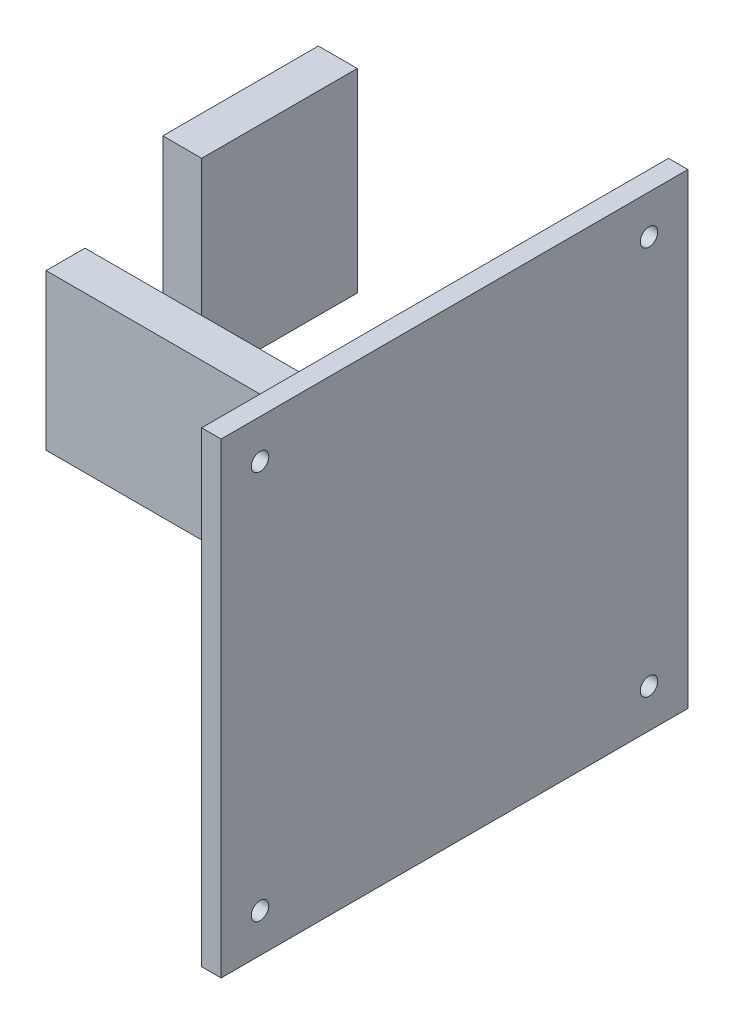
ISO-10303-21;
HEADER;
FILE_DESCRIPTION(('STEP AP214'),'2;1');
FILE_NAME('part.step','',(''),(''),'','','');
FILE_SCHEMA(('AUTOMOTIVE_DESIGN { 1 0 10303 214 1 1 1 1 }'));
ENDSEC;
DATA;
#1=APPLICATION_CONTEXT('core data for automotive mechanical design processes');
#2=APPLICATION_PROTOCOL_DEFINITION('international standard','automotive_design',2000,#1);
#3=PRODUCT_CONTEXT('',#1,'mechanical');
#4=PRODUCT('Part','Part','',(#3));
#5=PRODUCT_RELATED_PRODUCT_CATEGORY('part','',(#4));
#6=PRODUCT_DEFINITION_FORMATION('','',#4);
#7=PRODUCT_DEFINITION_CONTEXT('part definition',#1,'design');
#8=PRODUCT_DEFINITION('design','',#6,#7);
#9=PRODUCT_DEFINITION_SHAPE('','',#8);
#10=(LENGTH_UNIT() NAMED_UNIT(*) SI_UNIT(.MILLI.,.METRE.));
#11=(NAMED_UNIT(*) PLANE_ANGLE_UNIT() SI_UNIT($,.RADIAN.));
#12=(NAMED_UNIT(*) SI_UNIT($,.STERADIAN.) SOLID_ANGLE_UNIT());
#13=UNCERTAINTY_MEASURE_WITH_UNIT(LENGTH_MEASURE(1.E-05),#10,'distance_accuracy_value','');
#14=(GEOMETRIC_REPRESENTATION_CONTEXT(3) GLOBAL_UNCERTAINTY_ASSIGNED_CONTEXT((#13)) GLOBAL_UNIT_ASSIGNED_CONTEXT((#10,
#11,#12)) REPRESENTATION_CONTEXT('',''));
#15=CARTESIAN_POINT('',(0.,0.,0.));
#16=DIRECTION('',(0.,0.,1.));
#17=DIRECTION('',(1.,0.,0.));
#18=AXIS2_PLACEMENT_3D('',#15,#16,#17);
#19=CARTESIAN_POINT('',(9.99999999999999,20.,60.));
#20=DIRECTION('',(0.,-1.,0.));
#21=DIRECTION('',(0.,0.,-1.));
#22=AXIS2_PLACEMENT_3D('',#19,#20,#21);
#23=PLANE('',#22);
#24=DIRECTION('',(-1.,0.,0.));
#25=VECTOR('',#24,1.);
#26=CARTESIAN_POINT('',(9.99999999999999,20.,60.));
#27=LINE('',#26,#25);
#28=CARTESIAN_POINT('',(105.,20.,60.));
#29=VERTEX_POINT('',#28);
#30=CARTESIAN_POINT('',(9.99999999999999,20.,60.));
#31=VERTEX_POINT('',#30);
#32=EDGE_CURVE('E169',#29,#31,#27,.T.);
#33=ORIENTED_EDGE('',*,*,#32,.F.);
#34=DIRECTION('',(0.,0.,-1.));
#35=VECTOR('',#34,1.);
#36=CARTESIAN_POINT('',(105.,20.,60.));
#37=LINE('',#36,#35);
#38=CARTESIAN_POINT('',(105.,20.,50.));
#39=VERTEX_POINT('',#38);
#40=EDGE_CURVE('E162',#29,#39,#37,.T.);
#41=ORIENTED_EDGE('',*,*,#40,.T.);
#42=DIRECTION('',(-1.,0.,0.));
#43=VECTOR('',#42,1.);
#44=CARTESIAN_POINT('',(9.99999999999999,20.,50.));
#45=LINE('',#44,#43);
#46=CARTESIAN_POINT('',(9.99999999999999,20.,50.));
#47=VERTEX_POINT('',#46);
#48=EDGE_CURVE('E170',#39,#47,#45,.T.);
#49=ORIENTED_EDGE('',*,*,#48,.T.);
#50=DIRECTION('',(0.,0.,-1.));
#51=VECTOR('',#50,1.);
#52=CARTESIAN_POINT('',(9.99999999999999,20.,60.));
#53=LINE('',#52,#51);
#54=EDGE_CURVE('E60',#31,#47,#53,.T.);
#55=ORIENTED_EDGE('',*,*,#54,.F.);
#56=EDGE_LOOP('',(#33,#41,#49,#55));
#57=FACE_BOUND('',#56,.T.);
#58=ADVANCED_FACE('F47',(#57),#23,.F.);
#59=CARTESIAN_POINT('',(9.99999999999999,-20.,60.));
#60=DIRECTION('',(1.,0.,0.));
#61=DIRECTION('',(0.,0.,-1.));
#62=AXIS2_PLACEMENT_3D('',#59,#60,#61);
#63=PLANE('',#62);
#64=DIRECTION('',(0.,-1.,0.));
#65=VECTOR('',#64,1.);
#66=CARTESIAN_POINT('',(9.99999999999999,-20.,50.));
#67=LINE('',#66,#65);
#68=CARTESIAN_POINT('',(9.99999999999999,-20.,50.));
#69=VERTEX_POINT('',#68);
#70=EDGE_CURVE('E179',#47,#69,#67,.T.);
#71=ORIENTED_EDGE('',*,*,#70,.T.);
#72=DIRECTION('',(0.,0.,-1.));
#73=VECTOR('',#72,1.);
#74=CARTESIAN_POINT('',(9.99999999999999,-20.,60.));
#75=LINE('',#74,#73);
#76=CARTESIAN_POINT('',(9.99999999999999,-20.,60.));
#77=VERTEX_POINT('',#76);
#78=EDGE_CURVE('E171',#77,#69,#75,.T.);
#79=ORIENTED_EDGE('',*,*,#78,.F.);
#80=DIRECTION('',(0.,-1.,0.));
#81=VECTOR('',#80,1.);
#82=CARTESIAN_POINT('',(9.99999999999999,-20.,60.));
#83=LINE('',#82,#81);
#84=EDGE_CURVE('E168',#31,#77,#83,.T.);
#85=ORIENTED_EDGE('',*,*,#84,.F.);
#86=ORIENTED_EDGE('',*,*,#54,.T.);
#87=EDGE_LOOP('',(#71,#79,#85,#86));
#88=FACE_BOUND('',#87,.T.);
#89=ADVANCED_FACE('F188',(#88),#63,.F.);
#90=CARTESIAN_POINT('',(9.99999999999999,-20.,60.));
#91=DIRECTION('',(0.,1.,0.));
#92=DIRECTION('',(0.,0.,1.));
#93=AXIS2_PLACEMENT_3D('',#90,#91,#92);
#94=PLANE('',#93);
#95=DIRECTION('',(1.,0.,0.));
#96=VECTOR('',#95,1.);
#97=CARTESIAN_POINT('',(9.99999999999999,-20.,50.));
#98=LINE('',#97,#96);
#99=CARTESIAN_POINT('',(105.,-20.,50.));
#100=VERTEX_POINT('',#99);
#101=EDGE_CURVE('E173',#69,#100,#98,.T.);
#102=ORIENTED_EDGE('',*,*,#101,.T.);
#103=DIRECTION('',(0.,0.,1.));
#104=VECTOR('',#103,1.);
#105=CARTESIAN_POINT('',(105.,-20.,60.));
#106=LINE('',#105,#104);
#107=CARTESIAN_POINT('',(105.,-20.,60.));
#108=VERTEX_POINT('',#107);
#109=EDGE_CURVE('E65',#100,#108,#106,.T.);
#110=ORIENTED_EDGE('',*,*,#109,.T.);
#111=DIRECTION('',(1.,0.,0.));
#112=VECTOR('',#111,1.);
#113=CARTESIAN_POINT('',(9.99999999999999,-20.,60.));
#114=LINE('',#113,#112);
#115=EDGE_CURVE('E172',#77,#108,#114,.T.);
#116=ORIENTED_EDGE('',*,*,#115,.F.);
#117=ORIENTED_EDGE('',*,*,#78,.T.);
#118=EDGE_LOOP('',(#102,#110,#116,#117));
#119=FACE_BOUND('',#118,.T.);
#120=ADVANCED_FACE('F194',(#119),#94,.F.);
#121=CARTESIAN_POINT('',(0.,0.,60.));
#122=DIRECTION('',(0.,0.,-1.));
#123=DIRECTION('',(-1.,0.,0.));
#124=AXIS2_PLACEMENT_3D('',#121,#122,#123);
#125=PLANE('',#124);
#126=ORIENTED_EDGE('',*,*,#115,.T.);
#127=DIRECTION('',(0.,1.,0.));
#128=VECTOR('',#127,1.);
#129=CARTESIAN_POINT('',(105.,0.,60.));
#130=LINE('',#129,#128);
#131=EDGE_CURVE('E72',#108,#29,#130,.T.);
#132=ORIENTED_EDGE('',*,*,#131,.T.);
#133=ORIENTED_EDGE('',*,*,#32,.T.);
#134=ORIENTED_EDGE('',*,*,#84,.T.);
#135=EDGE_LOOP('',(#126,#132,#133,#134));
#136=FACE_BOUND('',#135,.T.);
#137=ADVANCED_FACE('F191',(#136),#125,.F.);
#138=CARTESIAN_POINT('',(0.,0.,50.));
#139=DIRECTION('',(0.,0.,-1.));
#140=DIRECTION('',(-1.,0.,0.));
#141=AXIS2_PLACEMENT_3D('',#138,#139,#140);
#142=PLANE('',#141);
#143=DIRECTION('',(0.,1.,0.));
#144=VECTOR('',#143,1.);
#145=CARTESIAN_POINT('',(105.,0.,50.));
#146=LINE('',#145,#144);
#147=EDGE_CURVE('E12',#100,#39,#146,.T.);
#148=ORIENTED_EDGE('',*,*,#147,.F.);
#149=ORIENTED_EDGE('',*,*,#101,.F.);
#150=ORIENTED_EDGE('',*,*,#70,.F.);
#151=ORIENTED_EDGE('',*,*,#48,.F.);
#152=EDGE_LOOP('',(#148,#149,#150,#151));
#153=FACE_BOUND('',#152,.T.);
#154=ADVANCED_FACE('F192',(#153),#142,.T.);
#155=CARTESIAN_POINT('',(105.,0.,0.));
#156=DIRECTION('',(-1.,0.,0.));
#157=DIRECTION('',(0.,0.,1.));
#158=AXIS2_PLACEMENT_3D('',#155,#156,#157);
#159=PLANE('',#158);
#160=CARTESIAN_POINT('',(105.,50.,105.));
#161=DIRECTION('',(-1.,0.,0.));
#162=DIRECTION('',(0.,0.,1.));
#163=AXIS2_PLACEMENT_3D('',#160,#161,#162);
#164=CIRCLE('',#163,2.25);
#165=CARTESIAN_POINT('',(105.,50.,107.25));
#166=VERTEX_POINT('',#165);
#167=EDGE_CURVE('E146',#166,#166,#164,.T.);
#168=ORIENTED_EDGE('',*,*,#167,.F.);
#169=EDGE_LOOP('',(#168));
#170=FACE_BOUND('',#169,.T.);
#171=CARTESIAN_POINT('',(105.,-50.,5.));
#172=DIRECTION('',(-1.,0.,0.));
#173=DIRECTION('',(0.,0.,1.));
#174=AXIS2_PLACEMENT_3D('',#171,#172,#173);
#175=CIRCLE('',#174,2.25);
#176=CARTESIAN_POINT('',(105.,-50.,7.25));
#177=VERTEX_POINT('',#176);
#178=EDGE_CURVE('E349',#177,#177,#175,.T.);
#179=ORIENTED_EDGE('',*,*,#178,.F.);
#180=EDGE_LOOP('',(#179));
#181=FACE_BOUND('',#180,.T.);
#182=CARTESIAN_POINT('',(105.,50.,5.));
#183=DIRECTION('',(-1.,0.,0.));
#184=DIRECTION('',(0.,0.,1.));
#185=AXIS2_PLACEMENT_3D('',#182,#183,#184);
#186=CIRCLE('',#185,2.25);
#187=CARTESIAN_POINT('',(105.,50.,7.25));
#188=VERTEX_POINT('',#187);
#189=EDGE_CURVE('E350',#188,#188,#186,.T.);
#190=ORIENTED_EDGE('',*,*,#189,.F.);
#191=EDGE_LOOP('',(#190));
#192=FACE_BOUND('',#191,.T.);
#193=CARTESIAN_POINT('',(105.,-50.,105.));
#194=DIRECTION('',(-1.,0.,0.));
#195=DIRECTION('',(0.,0.,1.));
#196=AXIS2_PLACEMENT_3D('',#193,#194,#195);
#197=CIRCLE('',#196,2.25);
#198=CARTESIAN_POINT('',(105.,-50.,107.25));
#199=VERTEX_POINT('',#198);
#200=EDGE_CURVE('E337',#199,#199,#197,.T.);
#201=ORIENTED_EDGE('',*,*,#200,.F.);
#202=EDGE_LOOP('',(#201));
#203=FACE_BOUND('',#202,.T.);
#204=DIRECTION('',(0.,1.,0.));
#205=VECTOR('',#204,1.);
#206=CARTESIAN_POINT('',(105.,-60.,-5.));
#207=LINE('',#206,#205);
#208=CARTESIAN_POINT('',(105.,-60.,-5.));
#209=VERTEX_POINT('',#208);
#210=CARTESIAN_POINT('',(105.,60.,-5.));
#211=VERTEX_POINT('',#210);
#212=EDGE_CURVE('E131',#209,#211,#207,.T.);
#213=ORIENTED_EDGE('',*,*,#212,.F.);
#214=DIRECTION('',(0.,0.,-1.));
#215=VECTOR('',#214,1.);
#216=CARTESIAN_POINT('',(105.,-60.,115.));
#217=LINE('',#216,#215);
#218=CARTESIAN_POINT('',(105.,-60.,115.));
#219=VERTEX_POINT('',#218);
#220=EDGE_CURVE('E130',#219,#209,#217,.T.);
#221=ORIENTED_EDGE('',*,*,#220,.F.);
#222=DIRECTION('',(0.,-1.,0.));
#223=VECTOR('',#222,1.);
#224=CARTESIAN_POINT('',(105.,-60.,115.));
#225=LINE('',#224,#223);
#226=CARTESIAN_POINT('',(105.,60.,115.));
#227=VERTEX_POINT('',#226);
#228=EDGE_CURVE('E140',#227,#219,#225,.T.);
#229=ORIENTED_EDGE('',*,*,#228,.F.);
#230=DIRECTION('',(0.,0.,1.));
#231=VECTOR('',#230,1.);
#232=CARTESIAN_POINT('',(105.,60.,115.));
#233=LINE('',#232,#231);
#234=EDGE_CURVE('E120',#211,#227,#233,.T.);
#235=ORIENTED_EDGE('',*,*,#234,.F.);
#236=EDGE_LOOP('',(#213,#221,#229,#235));
#237=FACE_BOUND('',#236,.T.);
#238=ORIENTED_EDGE('',*,*,#131,.F.);
#239=ORIENTED_EDGE('',*,*,#109,.F.);
#240=ORIENTED_EDGE('',*,*,#147,.T.);
#241=ORIENTED_EDGE('',*,*,#40,.F.);
#242=EDGE_LOOP('',(#238,#239,#240,#241));
#243=FACE_BOUND('',#242,.T.);
#244=ADVANCED_FACE('F134',(#170,#181,#192,#203,#237,#243),#159,.T.);
#245=CARTESIAN_POINT('',(105.,-60.,-5.));
#246=DIRECTION('',(0.,0.,-1.));
#247=DIRECTION('',(-1.,0.,0.));
#248=AXIS2_PLACEMENT_3D('',#245,#246,#247);
#249=PLANE('',#248);
#250=DIRECTION('',(0.,1.,0.));
#251=VECTOR('',#250,1.);
#252=CARTESIAN_POINT('',(110.,-60.,-5.));
#253=LINE('',#252,#251);
#254=CARTESIAN_POINT('',(110.,-60.,-5.));
#255=VERTEX_POINT('',#254);
#256=CARTESIAN_POINT('',(110.,60.,-5.));
#257=VERTEX_POINT('',#256);
#258=EDGE_CURVE('E153',#255,#257,#253,.T.);
#259=ORIENTED_EDGE('',*,*,#258,.F.);
#260=DIRECTION('',(1.,0.,0.));
#261=VECTOR('',#260,1.);
#262=CARTESIAN_POINT('',(105.,-60.,-5.));
#263=LINE('',#262,#261);
#264=EDGE_CURVE('E143',#209,#255,#263,.T.);
#265=ORIENTED_EDGE('',*,*,#264,.F.);
#266=ORIENTED_EDGE('',*,*,#212,.T.);
#267=DIRECTION('',(1.,0.,0.));
#268=VECTOR('',#267,1.);
#269=CARTESIAN_POINT('',(105.,60.,-5.));
#270=LINE('',#269,#268);
#271=EDGE_CURVE('E118',#211,#257,#270,.T.);
#272=ORIENTED_EDGE('',*,*,#271,.T.);
#273=EDGE_LOOP('',(#259,#265,#266,#272));
#274=FACE_BOUND('',#273,.T.);
#275=ADVANCED_FACE('F138',(#274),#249,.T.);
#276=CARTESIAN_POINT('',(105.,-60.,115.));
#277=DIRECTION('',(0.,-1.,0.));
#278=DIRECTION('',(0.,0.,-1.));
#279=AXIS2_PLACEMENT_3D('',#276,#277,#278);
#280=PLANE('',#279);
#281=DIRECTION('',(0.,0.,-1.));
#282=VECTOR('',#281,1.);
#283=CARTESIAN_POINT('',(110.,-60.,115.));
#284=LINE('',#283,#282);
#285=CARTESIAN_POINT('',(110.,-60.,115.));
#286=VERTEX_POINT('',#285);
#287=EDGE_CURVE('E142',#286,#255,#284,.T.);
#288=ORIENTED_EDGE('',*,*,#287,.F.);
#289=DIRECTION('',(1.,0.,0.));
#290=VECTOR('',#289,1.);
#291=CARTESIAN_POINT('',(105.,-60.,115.));
#292=LINE('',#291,#290);
#293=EDGE_CURVE('E157',#219,#286,#292,.T.);
#294=ORIENTED_EDGE('',*,*,#293,.F.);
#295=ORIENTED_EDGE('',*,*,#220,.T.);
#296=ORIENTED_EDGE('',*,*,#264,.T.);
#297=EDGE_LOOP('',(#288,#294,#295,#296));
#298=FACE_BOUND('',#297,.T.);
#299=ADVANCED_FACE('F252',(#298),#280,.T.);
#300=CARTESIAN_POINT('',(105.,-60.,115.));
#301=DIRECTION('',(0.,0.,1.));
#302=DIRECTION('',(1.,0.,0.));
#303=AXIS2_PLACEMENT_3D('',#300,#301,#302);
#304=PLANE('',#303);
#305=DIRECTION('',(0.,-1.,0.));
#306=VECTOR('',#305,1.);
#307=CARTESIAN_POINT('',(110.,-60.,115.));
#308=LINE('',#307,#306);
#309=CARTESIAN_POINT('',(110.,60.,115.));
#310=VERTEX_POINT('',#309);
#311=EDGE_CURVE('E144',#310,#286,#308,.T.);
#312=ORIENTED_EDGE('',*,*,#311,.F.);
#313=DIRECTION('',(1.,0.,0.));
#314=VECTOR('',#313,1.);
#315=CARTESIAN_POINT('',(105.,60.,115.));
#316=LINE('',#315,#314);
#317=EDGE_CURVE('E127',#227,#310,#316,.T.);
#318=ORIENTED_EDGE('',*,*,#317,.F.);
#319=ORIENTED_EDGE('',*,*,#228,.T.);
#320=ORIENTED_EDGE('',*,*,#293,.T.);
#321=EDGE_LOOP('',(#312,#318,#319,#320));
#322=FACE_BOUND('',#321,.T.);
#323=ADVANCED_FACE('F257',(#322),#304,.T.);
#324=CARTESIAN_POINT('',(105.,60.,115.));
#325=DIRECTION('',(0.,1.,0.));
#326=DIRECTION('',(0.,0.,1.));
#327=AXIS2_PLACEMENT_3D('',#324,#325,#326);
#328=PLANE('',#327);
#329=DIRECTION('',(0.,0.,1.));
#330=VECTOR('',#329,1.);
#331=CARTESIAN_POINT('',(110.,60.,115.));
#332=LINE('',#331,#330);
#333=EDGE_CURVE('E122',#257,#310,#332,.T.);
#334=ORIENTED_EDGE('',*,*,#333,.F.);
#335=ORIENTED_EDGE('',*,*,#271,.F.);
#336=ORIENTED_EDGE('',*,*,#234,.T.);
#337=ORIENTED_EDGE('',*,*,#317,.T.);
#338=EDGE_LOOP('',(#334,#335,#336,#337));
#339=FACE_BOUND('',#338,.T.);
#340=ADVANCED_FACE('F117',(#339),#328,.T.);
#341=CARTESIAN_POINT('',(110.,-20.,60.));
#342=DIRECTION('',(-1.,0.,0.));
#343=DIRECTION('',(0.,0.,1.));
#344=AXIS2_PLACEMENT_3D('',#341,#342,#343);
#345=PLANE('',#344);
#346=CARTESIAN_POINT('',(110.,50.,105.));
#347=DIRECTION('',(1.,0.,0.));
#348=DIRECTION('',(0.,0.,-1.));
#349=AXIS2_PLACEMENT_3D('',#346,#347,#348);
#350=CIRCLE('',#349,2.25);
#351=CARTESIAN_POINT('',(110.,50.,102.75));
#352=VERTEX_POINT('',#351);
#353=EDGE_CURVE('E334',#352,#352,#350,.T.);
#354=ORIENTED_EDGE('',*,*,#353,.F.);
#355=EDGE_LOOP('',(#354));
#356=FACE_BOUND('',#355,.T.);
#357=CARTESIAN_POINT('',(110.,-50.,5.));
#358=DIRECTION('',(1.,0.,0.));
#359=DIRECTION('',(0.,0.,-1.));
#360=AXIS2_PLACEMENT_3D('',#357,#358,#359);
#361=CIRCLE('',#360,2.25);
#362=CARTESIAN_POINT('',(110.,-50.,2.75));
#363=VERTEX_POINT('',#362);
#364=EDGE_CURVE('E333',#363,#363,#361,.T.);
#365=ORIENTED_EDGE('',*,*,#364,.F.);
#366=EDGE_LOOP('',(#365));
#367=FACE_BOUND('',#366,.T.);
#368=CARTESIAN_POINT('',(110.,50.,5.));
#369=DIRECTION('',(1.,0.,0.));
#370=DIRECTION('',(0.,0.,-1.));
#371=AXIS2_PLACEMENT_3D('',#368,#369,#370);
#372=CIRCLE('',#371,2.25);
#373=CARTESIAN_POINT('',(110.,50.,2.75));
#374=VERTEX_POINT('',#373);
#375=EDGE_CURVE('E342',#374,#374,#372,.T.);
#376=ORIENTED_EDGE('',*,*,#375,.F.);
#377=EDGE_LOOP('',(#376));
#378=FACE_BOUND('',#377,.T.);
#379=CARTESIAN_POINT('',(110.,-50.,105.));
#380=DIRECTION('',(1.,0.,0.));
#381=DIRECTION('',(0.,0.,-1.));
#382=AXIS2_PLACEMENT_3D('',#379,#380,#381);
#383=CIRCLE('',#382,2.25);
#384=CARTESIAN_POINT('',(110.,-50.,102.75));
#385=VERTEX_POINT('',#384);
#386=EDGE_CURVE('E331',#385,#385,#383,.T.);
#387=ORIENTED_EDGE('',*,*,#386,.F.);
#388=EDGE_LOOP('',(#387));
#389=FACE_BOUND('',#388,.T.);
#390=ORIENTED_EDGE('',*,*,#258,.T.);
#391=ORIENTED_EDGE('',*,*,#333,.T.);
#392=ORIENTED_EDGE('',*,*,#311,.T.);
#393=ORIENTED_EDGE('',*,*,#287,.T.);
#394=EDGE_LOOP('',(#390,#391,#392,#393));
#395=FACE_BOUND('',#394,.T.);
#396=ADVANCED_FACE('F51',(#356,#367,#378,#389,#395),#345,.F.);
#397=CARTESIAN_POINT('',(100.,-50.,105.));
#398=DIRECTION('',(1.,0.,0.));
#399=DIRECTION('',(0.,0.,-1.));
#400=AXIS2_PLACEMENT_3D('',#397,#398,#399);
#401=CYLINDRICAL_SURFACE('',#400,2.25);
#402=ORIENTED_EDGE('',*,*,#200,.T.);
#403=EDGE_LOOP('',(#402));
#404=FACE_BOUND('',#403,.T.);
#405=ORIENTED_EDGE('',*,*,#386,.T.);
#406=EDGE_LOOP('',(#405));
#407=FACE_BOUND('',#406,.T.);
#408=ADVANCED_FACE('F281',(#404,#407),#401,.F.);
#409=CARTESIAN_POINT('',(100.,50.,5.));
#410=DIRECTION('',(1.,0.,0.));
#411=DIRECTION('',(0.,0.,-1.));
#412=AXIS2_PLACEMENT_3D('',#409,#410,#411);
#413=CYLINDRICAL_SURFACE('',#412,2.25);
#414=ORIENTED_EDGE('',*,*,#189,.T.);
#415=EDGE_LOOP('',(#414));
#416=FACE_BOUND('',#415,.T.);
#417=ORIENTED_EDGE('',*,*,#375,.T.);
#418=EDGE_LOOP('',(#417));
#419=FACE_BOUND('',#418,.T.);
#420=ADVANCED_FACE('F293',(#416,#419),#413,.F.);
#421=CARTESIAN_POINT('',(100.,-50.,5.));
#422=DIRECTION('',(1.,0.,0.));
#423=DIRECTION('',(0.,0.,-1.));
#424=AXIS2_PLACEMENT_3D('',#421,#422,#423);
#425=CYLINDRICAL_SURFACE('',#424,2.25);
#426=ORIENTED_EDGE('',*,*,#178,.T.);
#427=EDGE_LOOP('',(#426));
#428=FACE_BOUND('',#427,.T.);
#429=ORIENTED_EDGE('',*,*,#364,.T.);
#430=EDGE_LOOP('',(#429));
#431=FACE_BOUND('',#430,.T.);
#432=ADVANCED_FACE('F303',(#428,#431),#425,.F.);
#433=CARTESIAN_POINT('',(100.,50.,105.));
#434=DIRECTION('',(1.,0.,0.));
#435=DIRECTION('',(0.,0.,-1.));
#436=AXIS2_PLACEMENT_3D('',#433,#434,#435);
#437=CYLINDRICAL_SURFACE('',#436,2.25);
#438=ORIENTED_EDGE('',*,*,#167,.T.);
#439=EDGE_LOOP('',(#438));
#440=FACE_BOUND('',#439,.T.);
#441=ORIENTED_EDGE('',*,*,#353,.T.);
#442=EDGE_LOOP('',(#441));
#443=FACE_BOUND('',#442,.T.);
#444=ADVANCED_FACE('F312',(#440,#443),#437,.F.);
#445=CLOSED_SHELL('',(#58,#89,#120,#137,#154,#244,#275,#299,#323,#340,#396,#408,#420,#432,#444));
#446=MANIFOLD_SOLID_BREP('B2',#445);
#447=CARTESIAN_POINT('',(10.,-25.,-20.));
#448=DIRECTION('',(0.,0.,1.));
#449=DIRECTION('',(1.,0.,0.));
#450=AXIS2_PLACEMENT_3D('',#447,#448,#449);
#451=PLANE('',#450);
#452=DIRECTION('',(0.,1.,0.));
#453=VECTOR('',#452,1.);
#454=CARTESIAN_POINT('',(0.,-25.,-20.));
#455=LINE('',#454,#453);
#456=CARTESIAN_POINT('',(0.,-25.,-20.));
#457=VERTEX_POINT('',#456);
#458=CARTESIAN_POINT('',(0.,25.,-20.));
#459=VERTEX_POINT('',#458);
#460=EDGE_CURVE('E437',#457,#459,#455,.T.);
#461=ORIENTED_EDGE('',*,*,#460,.T.);
#462=DIRECTION('',(-1.,0.,0.));
#463=VECTOR('',#462,1.);
#464=CARTESIAN_POINT('',(10.,25.,-20.));
#465=LINE('',#464,#463);
#466=CARTESIAN_POINT('',(10.,25.,-20.));
#467=VERTEX_POINT('',#466);
#468=EDGE_CURVE('E50',#467,#459,#465,.T.);
#469=ORIENTED_EDGE('',*,*,#468,.F.);
#470=DIRECTION('',(0.,1.,0.));
#471=VECTOR('',#470,1.);
#472=CARTESIAN_POINT('',(10.,-25.,-20.));
#473=LINE('',#472,#471);
#474=CARTESIAN_POINT('',(10.,-25.,-20.));
#475=VERTEX_POINT('',#474);
#476=EDGE_CURVE('E426',#475,#467,#473,.T.);
#477=ORIENTED_EDGE('',*,*,#476,.F.);
#478=DIRECTION('',(-1.,0.,0.));
#479=VECTOR('',#478,1.);
#480=CARTESIAN_POINT('',(10.,-25.,-20.));
#481=LINE('',#480,#479);
#482=EDGE_CURVE('E432',#475,#457,#481,.T.);
#483=ORIENTED_EDGE('',*,*,#482,.T.);
#484=EDGE_LOOP('',(#461,#469,#477,#483));
#485=FACE_BOUND('',#484,.T.);
#486=ADVANCED_FACE('F374',(#485),#451,.F.);
#487=CARTESIAN_POINT('',(10.,25.,20.));
#488=DIRECTION('',(0.,-1.,0.));
#489=DIRECTION('',(0.,0.,-1.));
#490=AXIS2_PLACEMENT_3D('',#487,#488,#489);
#491=PLANE('',#490);
#492=DIRECTION('',(0.,0.,1.));
#493=VECTOR('',#492,1.);
#494=CARTESIAN_POINT('',(0.,25.,20.));
#495=LINE('',#494,#493);
#496=CARTESIAN_POINT('',(0.,25.,20.));
#497=VERTEX_POINT('',#496);
#498=EDGE_CURVE('E429',#459,#497,#495,.T.);
#499=ORIENTED_EDGE('',*,*,#498,.T.);
#500=DIRECTION('',(-1.,0.,0.));
#501=VECTOR('',#500,1.);
#502=CARTESIAN_POINT('',(10.,25.,20.));
#503=LINE('',#502,#501);
#504=CARTESIAN_POINT('',(10.,25.,20.));
#505=VERTEX_POINT('',#504);
#506=EDGE_CURVE('E382',#505,#497,#503,.T.);
#507=ORIENTED_EDGE('',*,*,#506,.F.);
#508=DIRECTION('',(0.,0.,1.));
#509=VECTOR('',#508,1.);
#510=CARTESIAN_POINT('',(10.,25.,20.));
#511=LINE('',#510,#509);
#512=EDGE_CURVE('E423',#467,#505,#511,.T.);
#513=ORIENTED_EDGE('',*,*,#512,.F.);
#514=ORIENTED_EDGE('',*,*,#468,.T.);
#515=EDGE_LOOP('',(#499,#507,#513,#514));
#516=FACE_BOUND('',#515,.T.);
#517=ADVANCED_FACE('F427',(#516),#491,.F.);
#518=CARTESIAN_POINT('',(10.,-25.,20.));
#519=DIRECTION('',(0.,0.,-1.));
#520=DIRECTION('',(-1.,0.,0.));
#521=AXIS2_PLACEMENT_3D('',#518,#519,#520);
#522=PLANE('',#521);
#523=DIRECTION('',(0.,-1.,0.));
#524=VECTOR('',#523,1.);
#525=CARTESIAN_POINT('',(0.,-25.,20.));
#526=LINE('',#525,#524);
#527=CARTESIAN_POINT('',(0.,-25.,20.));
#528=VERTEX_POINT('',#527);
#529=EDGE_CURVE('E407',#497,#528,#526,.T.);
#530=ORIENTED_EDGE('',*,*,#529,.T.);
#531=DIRECTION('',(-1.,0.,0.));
#532=VECTOR('',#531,1.);
#533=CARTESIAN_POINT('',(10.,-25.,20.));
#534=LINE('',#533,#532);
#535=CARTESIAN_POINT('',(10.,-25.,20.));
#536=VERTEX_POINT('',#535);
#537=EDGE_CURVE('E431',#536,#528,#534,.T.);
#538=ORIENTED_EDGE('',*,*,#537,.F.);
#539=DIRECTION('',(0.,-1.,0.));
#540=VECTOR('',#539,1.);
#541=CARTESIAN_POINT('',(10.,-25.,20.));
#542=LINE('',#541,#540);
#543=EDGE_CURVE('E424',#505,#536,#542,.T.);
#544=ORIENTED_EDGE('',*,*,#543,.F.);
#545=ORIENTED_EDGE('',*,*,#506,.T.);
#546=EDGE_LOOP('',(#530,#538,#544,#545));
#547=FACE_BOUND('',#546,.T.);
#548=ADVANCED_FACE('F435',(#547),#522,.F.);
#549=CARTESIAN_POINT('',(10.,-25.,20.));
#550=DIRECTION('',(0.,1.,0.));
#551=DIRECTION('',(0.,0.,1.));
#552=AXIS2_PLACEMENT_3D('',#549,#550,#551);
#553=PLANE('',#552);
#554=DIRECTION('',(0.,0.,-1.));
#555=VECTOR('',#554,1.);
#556=CARTESIAN_POINT('',(0.,-25.,20.));
#557=LINE('',#556,#555);
#558=EDGE_CURVE('E411',#528,#457,#557,.T.);
#559=ORIENTED_EDGE('',*,*,#558,.T.);
#560=ORIENTED_EDGE('',*,*,#482,.F.);
#561=DIRECTION('',(0.,0.,-1.));
#562=VECTOR('',#561,1.);
#563=CARTESIAN_POINT('',(10.,-25.,20.));
#564=LINE('',#563,#562);
#565=EDGE_CURVE('E393',#536,#475,#564,.T.);
#566=ORIENTED_EDGE('',*,*,#565,.F.);
#567=ORIENTED_EDGE('',*,*,#537,.T.);
#568=EDGE_LOOP('',(#559,#560,#566,#567));
#569=FACE_BOUND('',#568,.T.);
#570=ADVANCED_FACE('F443',(#569),#553,.F.);
#571=CARTESIAN_POINT('',(10.,0.,0.));
#572=DIRECTION('',(-1.,0.,0.));
#573=DIRECTION('',(0.,0.,1.));
#574=AXIS2_PLACEMENT_3D('',#571,#572,#573);
#575=PLANE('',#574);
#576=ORIENTED_EDGE('',*,*,#476,.T.);
#577=ORIENTED_EDGE('',*,*,#512,.T.);
#578=ORIENTED_EDGE('',*,*,#543,.T.);
#579=ORIENTED_EDGE('',*,*,#565,.T.);
#580=EDGE_LOOP('',(#576,#577,#578,#579));
#581=FACE_BOUND('',#580,.T.);
#582=ADVANCED_FACE('F425',(#581),#575,.F.);
#583=CARTESIAN_POINT('',(0.,0.,0.));
#584=DIRECTION('',(-1.,0.,0.));
#585=DIRECTION('',(0.,0.,1.));
#586=AXIS2_PLACEMENT_3D('',#583,#584,#585);
#587=PLANE('',#586);
#588=ORIENTED_EDGE('',*,*,#460,.F.);
#589=ORIENTED_EDGE('',*,*,#558,.F.);
#590=ORIENTED_EDGE('',*,*,#529,.F.);
#591=ORIENTED_EDGE('',*,*,#498,.F.);
#592=EDGE_LOOP('',(#588,#589,#590,#591));
#593=FACE_BOUND('',#592,.T.);
#594=ADVANCED_FACE('F447',(#593),#587,.T.);
#595=CLOSED_SHELL('',(#486,#517,#548,#570,#582,#594));
#596=MANIFOLD_SOLID_BREP('B6',#595);
#597=ADVANCED_BREP_SHAPE_REPRESENTATION('',(#18,#446,#596),#14);
#598=SHAPE_DEFINITION_REPRESENTATION(#9,#597);
ENDSEC;
END-ISO-10303-21;
